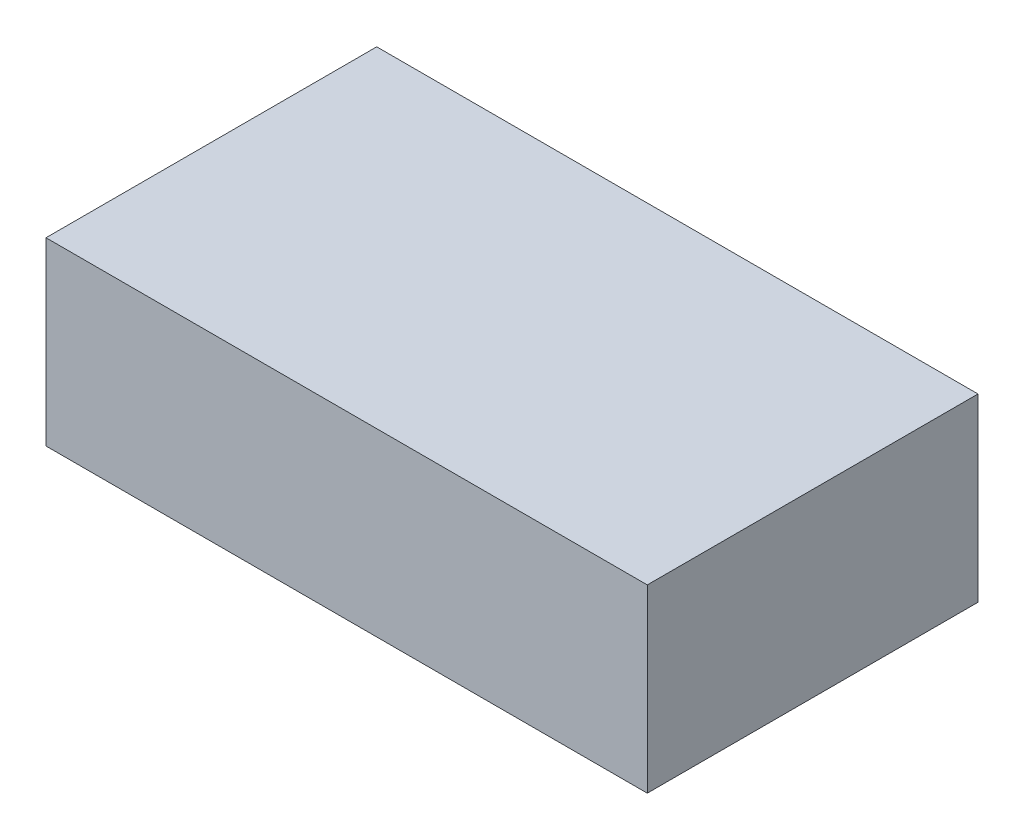
ISO-10303-21;
HEADER;
FILE_DESCRIPTION(('STEP AP214'),'2;1');
FILE_NAME('part.step','',(''),(''),'','','');
FILE_SCHEMA(('AUTOMOTIVE_DESIGN { 1 0 10303 214 1 1 1 1 }'));
ENDSEC;
DATA;
#1=APPLICATION_CONTEXT('core data for automotive mechanical design processes');
#2=APPLICATION_PROTOCOL_DEFINITION('international standard','automotive_design',2000,#1);
#3=PRODUCT_CONTEXT('',#1,'mechanical');
#4=PRODUCT('Part','Part','',(#3));
#5=PRODUCT_RELATED_PRODUCT_CATEGORY('part','',(#4));
#6=PRODUCT_DEFINITION_FORMATION('','',#4);
#7=PRODUCT_DEFINITION_CONTEXT('part definition',#1,'design');
#8=PRODUCT_DEFINITION('design','',#6,#7);
#9=PRODUCT_DEFINITION_SHAPE('','',#8);
#10=(LENGTH_UNIT() NAMED_UNIT(*) SI_UNIT(.MILLI.,.METRE.));
#11=(NAMED_UNIT(*) PLANE_ANGLE_UNIT() SI_UNIT($,.RADIAN.));
#12=(NAMED_UNIT(*) SI_UNIT($,.STERADIAN.) SOLID_ANGLE_UNIT());
#13=UNCERTAINTY_MEASURE_WITH_UNIT(LENGTH_MEASURE(1.E-05),#10,'distance_accuracy_value','');
#14=(GEOMETRIC_REPRESENTATION_CONTEXT(3) GLOBAL_UNCERTAINTY_ASSIGNED_CONTEXT((#13)) GLOBAL_UNIT_ASSIGNED_CONTEXT((#10,
#11,#12)) REPRESENTATION_CONTEXT('',''));
#15=CARTESIAN_POINT('',(0.,0.,0.));
#16=DIRECTION('',(0.,0.,1.));
#17=DIRECTION('',(1.,0.,0.));
#18=AXIS2_PLACEMENT_3D('',#15,#16,#17);
#19=CARTESIAN_POINT('',(-0.499999,-0.1499997,0.));
#20=DIRECTION('',(0.,1.,0.));
#21=DIRECTION('',(0.,0.,1.));
#22=AXIS2_PLACEMENT_3D('',#19,#20,#21);
#23=PLANE('',#22);
#24=DIRECTION('',(0.,0.,1.));
#25=VECTOR('',#24,1.);
#26=CARTESIAN_POINT('',(0.50000154,-0.1499997,0.));
#27=LINE('',#26,#25);
#28=CARTESIAN_POINT('',(0.50000154,-0.1499997,0.));
#29=VERTEX_POINT('',#28);
#30=CARTESIAN_POINT('',(0.50000154,-0.1499997,0.5499989));
#31=VERTEX_POINT('',#30);
#32=EDGE_CURVE('E20',#29,#31,#27,.T.);
#33=ORIENTED_EDGE('',*,*,#32,.T.);
#34=DIRECTION('',(-1.,0.,0.));
#35=VECTOR('',#34,1.);
#36=CARTESIAN_POINT('',(0.50000154,-0.1499997,0.5499989));
#37=LINE('',#36,#35);
#38=CARTESIAN_POINT('',(-0.499999,-0.1499997,0.5499989));
#39=VERTEX_POINT('',#38);
#40=EDGE_CURVE('E55',#31,#39,#37,.T.);
#41=ORIENTED_EDGE('',*,*,#40,.T.);
#42=DIRECTION('',(0.,0.,-1.));
#43=VECTOR('',#42,1.);
#44=CARTESIAN_POINT('',(-0.499999,-0.1499997,0.));
#45=LINE('',#44,#43);
#46=CARTESIAN_POINT('',(-0.499999,-0.1499997,0.));
#47=VERTEX_POINT('',#46);
#48=EDGE_CURVE('E76',#39,#47,#45,.T.);
#49=ORIENTED_EDGE('',*,*,#48,.T.);
#50=DIRECTION('',(-1.,0.,0.));
#51=VECTOR('',#50,1.);
#52=CARTESIAN_POINT('',(0.50000154,-0.1499997,0.));
#53=LINE('',#52,#51);
#54=EDGE_CURVE('E58',#29,#47,#53,.T.);
#55=ORIENTED_EDGE('',*,*,#54,.F.);
#56=EDGE_LOOP('',(#33,#41,#49,#55));
#57=FACE_BOUND('',#56,.T.);
#58=ADVANCED_FACE('F17',(#57),#23,.F.);
#59=CARTESIAN_POINT('',(0.50000154,-0.1499997,0.));
#60=DIRECTION('',(-1.,0.,0.));
#61=DIRECTION('',(0.,0.,1.));
#62=AXIS2_PLACEMENT_3D('',#59,#60,#61);
#63=PLANE('',#62);
#64=DIRECTION('',(0.,0.,-1.));
#65=VECTOR('',#64,1.);
#66=CARTESIAN_POINT('',(0.50000154,0.1499997,0.));
#67=LINE('',#66,#65);
#68=CARTESIAN_POINT('',(0.50000154,0.1499997,0.));
#69=VERTEX_POINT('',#68);
#70=CARTESIAN_POINT('',(0.50000154,0.1499997,0.5499989));
#71=VERTEX_POINT('',#70);
#72=EDGE_CURVE('E73',#69,#71,#67,.F.);
#73=ORIENTED_EDGE('',*,*,#72,.T.);
#74=DIRECTION('',(0.,1.,0.));
#75=VECTOR('',#74,1.);
#76=CARTESIAN_POINT('',(0.50000154,0.1499997,0.5499989));
#77=LINE('',#76,#75);
#78=EDGE_CURVE('E63',#71,#31,#77,.F.);
#79=ORIENTED_EDGE('',*,*,#78,.T.);
#80=ORIENTED_EDGE('',*,*,#32,.F.);
#81=DIRECTION('',(0.,1.,0.));
#82=VECTOR('',#81,1.);
#83=CARTESIAN_POINT('',(0.50000154,0.1499997,0.));
#84=LINE('',#83,#82);
#85=EDGE_CURVE('E78',#69,#29,#84,.F.);
#86=ORIENTED_EDGE('',*,*,#85,.F.);
#87=EDGE_LOOP('',(#73,#79,#80,#86));
#88=FACE_BOUND('',#87,.T.);
#89=ADVANCED_FACE('F72',(#88),#63,.F.);
#90=CARTESIAN_POINT('',(0.50000154,0.1499997,0.5499989));
#91=DIRECTION('',(0.,0.,-1.));
#92=DIRECTION('',(-1.,0.,0.));
#93=AXIS2_PLACEMENT_3D('',#90,#91,#92);
#94=PLANE('',#93);
#95=DIRECTION('',(0.,1.,0.));
#96=VECTOR('',#95,1.);
#97=CARTESIAN_POINT('',(-0.499999,0.1499997,0.5499989));
#98=LINE('',#97,#96);
#99=CARTESIAN_POINT('',(-0.499999,0.1499997,0.5499989));
#100=VERTEX_POINT('',#99);
#101=EDGE_CURVE('E69',#100,#39,#98,.F.);
#102=ORIENTED_EDGE('',*,*,#101,.T.);
#103=ORIENTED_EDGE('',*,*,#40,.F.);
#104=ORIENTED_EDGE('',*,*,#78,.F.);
#105=DIRECTION('',(1.,0.,0.));
#106=VECTOR('',#105,1.);
#107=CARTESIAN_POINT('',(0.50000154,0.1499997,0.5499989));
#108=LINE('',#107,#106);
#109=EDGE_CURVE('E83',#71,#100,#108,.F.);
#110=ORIENTED_EDGE('',*,*,#109,.T.);
#111=EDGE_LOOP('',(#102,#103,#104,#110));
#112=FACE_BOUND('',#111,.T.);
#113=ADVANCED_FACE('F66',(#112),#94,.F.);
#114=CARTESIAN_POINT('',(-0.499999,0.1499997,0.));
#115=DIRECTION('',(1.,0.,0.));
#116=DIRECTION('',(0.,0.,-1.));
#117=AXIS2_PLACEMENT_3D('',#114,#115,#116);
#118=PLANE('',#117);
#119=ORIENTED_EDGE('',*,*,#48,.F.);
#120=ORIENTED_EDGE('',*,*,#101,.F.);
#121=DIRECTION('',(0.,0.,-1.));
#122=VECTOR('',#121,1.);
#123=CARTESIAN_POINT('',(-0.499999,0.1499997,0.));
#124=LINE('',#123,#122);
#125=CARTESIAN_POINT('',(-0.499999,0.1499997,0.));
#126=VERTEX_POINT('',#125);
#127=EDGE_CURVE('E26',#100,#126,#124,.T.);
#128=ORIENTED_EDGE('',*,*,#127,.T.);
#129=DIRECTION('',(0.,1.,0.));
#130=VECTOR('',#129,1.);
#131=CARTESIAN_POINT('',(-0.499999,0.1499997,0.));
#132=LINE('',#131,#130);
#133=EDGE_CURVE('E34',#47,#126,#132,.T.);
#134=ORIENTED_EDGE('',*,*,#133,.F.);
#135=EDGE_LOOP('',(#119,#120,#128,#134));
#136=FACE_BOUND('',#135,.T.);
#137=ADVANCED_FACE('F88',(#136),#118,.F.);
#138=CARTESIAN_POINT('',(0.50000154,0.1499997,0.));
#139=DIRECTION('',(0.,0.,-1.));
#140=DIRECTION('',(-1.,0.,0.));
#141=AXIS2_PLACEMENT_3D('',#138,#139,#140);
#142=PLANE('',#141);
#143=ORIENTED_EDGE('',*,*,#133,.T.);
#144=DIRECTION('',(1.,0.,0.));
#145=VECTOR('',#144,1.);
#146=CARTESIAN_POINT('',(0.50000154,0.1499997,0.));
#147=LINE('',#146,#145);
#148=EDGE_CURVE('E11',#126,#69,#147,.T.);
#149=ORIENTED_EDGE('',*,*,#148,.T.);
#150=ORIENTED_EDGE('',*,*,#85,.T.);
#151=ORIENTED_EDGE('',*,*,#54,.T.);
#152=EDGE_LOOP('',(#143,#149,#150,#151));
#153=FACE_BOUND('',#152,.T.);
#154=ADVANCED_FACE('F91',(#153),#142,.T.);
#155=CARTESIAN_POINT('',(0.50000154,0.1499997,0.));
#156=DIRECTION('',(0.,-1.,0.));
#157=DIRECTION('',(0.,0.,-1.));
#158=AXIS2_PLACEMENT_3D('',#155,#156,#157);
#159=PLANE('',#158);
#160=ORIENTED_EDGE('',*,*,#127,.F.);
#161=ORIENTED_EDGE('',*,*,#109,.F.);
#162=ORIENTED_EDGE('',*,*,#72,.F.);
#163=ORIENTED_EDGE('',*,*,#148,.F.);
#164=EDGE_LOOP('',(#160,#161,#162,#163));
#165=FACE_BOUND('',#164,.T.);
#166=ADVANCED_FACE('F90',(#165),#159,.F.);
#167=CLOSED_SHELL('',(#58,#89,#113,#137,#154,#166));
#168=MANIFOLD_SOLID_BREP('B1',#167);
#169=ADVANCED_BREP_SHAPE_REPRESENTATION('',(#18,#168),#14);
#170=SHAPE_DEFINITION_REPRESENTATION(#9,#169);
ENDSEC;
END-ISO-10303-21;
